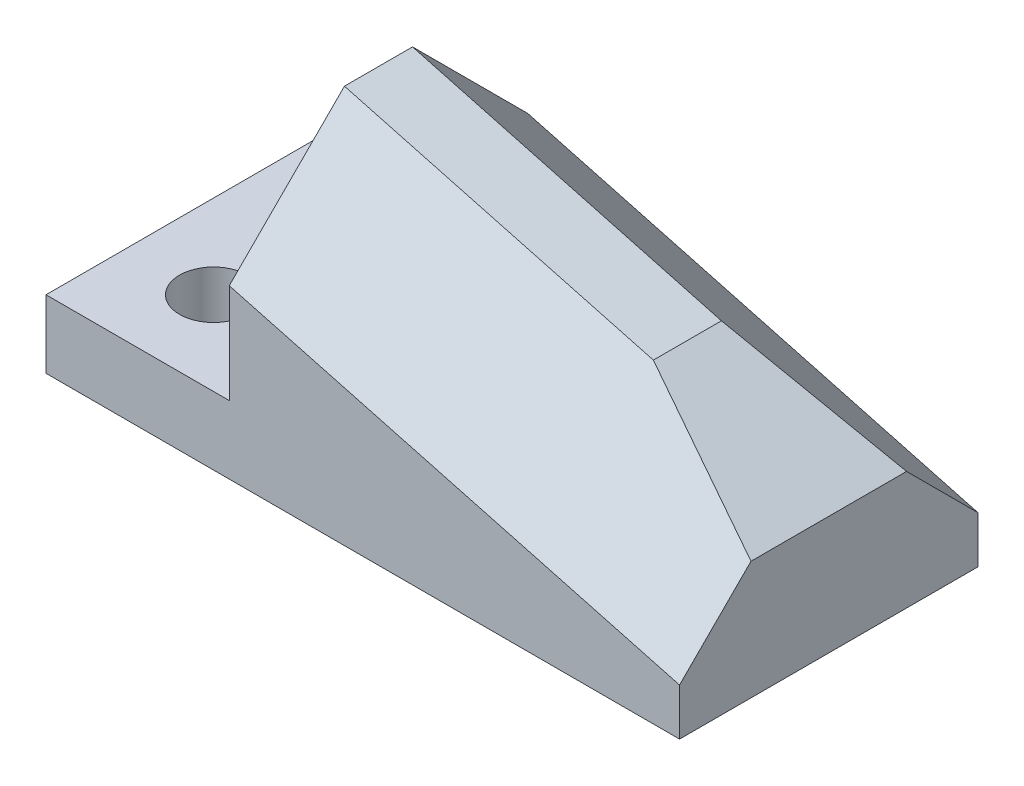
ISO-10303-21;
HEADER;
FILE_DESCRIPTION(('STEP AP214'),'2;1');
FILE_NAME('part.step','',(''),(''),'','','');
FILE_SCHEMA(('AUTOMOTIVE_DESIGN { 1 0 10303 214 1 1 1 1 }'));
ENDSEC;
DATA;
#1=APPLICATION_CONTEXT('core data for automotive mechanical design processes');
#2=APPLICATION_PROTOCOL_DEFINITION('international standard','automotive_design',2000,#1);
#3=PRODUCT_CONTEXT('',#1,'mechanical');
#4=PRODUCT('Part','Part','',(#3));
#5=PRODUCT_RELATED_PRODUCT_CATEGORY('part','',(#4));
#6=PRODUCT_DEFINITION_FORMATION('','',#4);
#7=PRODUCT_DEFINITION_CONTEXT('part definition',#1,'design');
#8=PRODUCT_DEFINITION('design','',#6,#7);
#9=PRODUCT_DEFINITION_SHAPE('','',#8);
#10=(LENGTH_UNIT() NAMED_UNIT(*) SI_UNIT(.MILLI.,.METRE.));
#11=(NAMED_UNIT(*) PLANE_ANGLE_UNIT() SI_UNIT($,.RADIAN.));
#12=(NAMED_UNIT(*) SI_UNIT($,.STERADIAN.) SOLID_ANGLE_UNIT());
#13=UNCERTAINTY_MEASURE_WITH_UNIT(LENGTH_MEASURE(1.E-05),#10,'distance_accuracy_value','');
#14=(GEOMETRIC_REPRESENTATION_CONTEXT(3) GLOBAL_UNCERTAINTY_ASSIGNED_CONTEXT((#13)) GLOBAL_UNIT_ASSIGNED_CONTEXT((#10,
#11,#12)) REPRESENTATION_CONTEXT('',''));
#15=CARTESIAN_POINT('',(0.,0.,0.));
#16=DIRECTION('',(0.,0.,1.));
#17=DIRECTION('',(1.,0.,0.));
#18=AXIS2_PLACEMENT_3D('',#15,#16,#17);
#19=CARTESIAN_POINT('',(-60.5,13.,28.5));
#20=DIRECTION('',(0.,-1.,0.));
#21=DIRECTION('',(0.,0.,-1.));
#22=AXIS2_PLACEMENT_3D('',#19,#20,#21);
#23=PLANE('',#22);
#24=CARTESIAN_POINT('',(-44.5,13.,12.5));
#25=DIRECTION('',(0.,1.,0.));
#26=DIRECTION('',(0.,0.,1.));
#27=AXIS2_PLACEMENT_3D('',#24,#25,#26);
#28=CIRCLE('',#27,6.5);
#29=CARTESIAN_POINT('',(-44.5,13.,19.));
#30=VERTEX_POINT('',#29);
#31=EDGE_CURVE('E156',#30,#30,#28,.T.);
#32=ORIENTED_EDGE('',*,*,#31,.F.);
#33=EDGE_LOOP('',(#32));
#34=FACE_BOUND('',#33,.T.);
#35=CARTESIAN_POINT('',(-44.5,13.,-12.5));
#36=DIRECTION('',(0.,1.,0.));
#37=DIRECTION('',(0.,0.,1.));
#38=AXIS2_PLACEMENT_3D('',#35,#36,#37);
#39=CIRCLE('',#38,6.5);
#40=CARTESIAN_POINT('',(-44.5,13.,-6.));
#41=VERTEX_POINT('',#40);
#42=EDGE_CURVE('E148',#41,#41,#39,.T.);
#43=ORIENTED_EDGE('',*,*,#42,.F.);
#44=EDGE_LOOP('',(#43));
#45=FACE_BOUND('',#44,.T.);
#46=DIRECTION('',(0.,0.,1.));
#47=VECTOR('',#46,1.);
#48=CARTESIAN_POINT('',(-25.5,13.,-28.5));
#49=LINE('',#48,#47);
#50=CARTESIAN_POINT('',(-25.5,13.,-28.5));
#51=VERTEX_POINT('',#50);
#52=CARTESIAN_POINT('',(-25.5,13.,28.5));
#53=VERTEX_POINT('',#52);
#54=EDGE_CURVE('E160',#51,#53,#49,.T.);
#55=ORIENTED_EDGE('',*,*,#54,.F.);
#56=DIRECTION('',(-1.,0.,0.));
#57=VECTOR('',#56,1.);
#58=CARTESIAN_POINT('',(-60.5,13.,-28.5));
#59=LINE('',#58,#57);
#60=CARTESIAN_POINT('',(-60.5,13.,-28.5));
#61=VERTEX_POINT('',#60);
#62=EDGE_CURVE('E166',#51,#61,#59,.T.);
#63=ORIENTED_EDGE('',*,*,#62,.T.);
#64=DIRECTION('',(0.,0.,-1.));
#65=VECTOR('',#64,1.);
#66=CARTESIAN_POINT('',(-60.5,13.,28.5));
#67=LINE('',#66,#65);
#68=CARTESIAN_POINT('',(-60.5,13.,28.5));
#69=VERTEX_POINT('',#68);
#70=EDGE_CURVE('E176',#69,#61,#67,.T.);
#71=ORIENTED_EDGE('',*,*,#70,.F.);
#72=DIRECTION('',(-1.,0.,0.));
#73=VECTOR('',#72,1.);
#74=CARTESIAN_POINT('',(-60.5,13.,28.5));
#75=LINE('',#74,#73);
#76=EDGE_CURVE('E173',#53,#69,#75,.T.);
#77=ORIENTED_EDGE('',*,*,#76,.F.);
#78=EDGE_LOOP('',(#55,#63,#71,#77));
#79=FACE_BOUND('',#78,.T.);
#80=ADVANCED_FACE('F39',(#34,#45,#79),#23,.F.);
#81=CARTESIAN_POINT('',(-60.5,0.,28.5));
#82=DIRECTION('',(1.,0.,0.));
#83=DIRECTION('',(0.,0.,-1.));
#84=AXIS2_PLACEMENT_3D('',#81,#82,#83);
#85=PLANE('',#84);
#86=DIRECTION('',(0.,-1.,0.));
#87=VECTOR('',#86,1.);
#88=CARTESIAN_POINT('',(-60.5,0.,-28.5));
#89=LINE('',#88,#87);
#90=CARTESIAN_POINT('',(-60.5,0.,-28.5));
#91=VERTEX_POINT('',#90);
#92=EDGE_CURVE('E147',#61,#91,#89,.T.);
#93=ORIENTED_EDGE('',*,*,#92,.T.);
#94=DIRECTION('',(0.,0.,-1.));
#95=VECTOR('',#94,1.);
#96=CARTESIAN_POINT('',(-60.5,0.,28.5));
#97=LINE('',#96,#95);
#98=CARTESIAN_POINT('',(-60.5,0.,28.5));
#99=VERTEX_POINT('',#98);
#100=EDGE_CURVE('E11',#99,#91,#97,.T.);
#101=ORIENTED_EDGE('',*,*,#100,.F.);
#102=DIRECTION('',(0.,-1.,0.));
#103=VECTOR('',#102,1.);
#104=CARTESIAN_POINT('',(-60.5,0.,28.5));
#105=LINE('',#104,#103);
#106=EDGE_CURVE('E161',#69,#99,#105,.T.);
#107=ORIENTED_EDGE('',*,*,#106,.F.);
#108=ORIENTED_EDGE('',*,*,#70,.T.);
#109=EDGE_LOOP('',(#93,#101,#107,#108));
#110=FACE_BOUND('',#109,.T.);
#111=ADVANCED_FACE('F41',(#110),#85,.F.);
#112=CARTESIAN_POINT('',(-60.5,0.,28.5));
#113=DIRECTION('',(0.,1.,0.));
#114=DIRECTION('',(0.,0.,1.));
#115=AXIS2_PLACEMENT_3D('',#112,#113,#114);
#116=PLANE('',#115);
#117=CARTESIAN_POINT('',(-44.5,0.,-12.5));
#118=DIRECTION('',(0.,1.,0.));
#119=DIRECTION('',(0.,0.,1.));
#120=AXIS2_PLACEMENT_3D('',#117,#118,#119);
#121=CIRCLE('',#120,6.5);
#122=CARTESIAN_POINT('',(-44.5,0.,-6.));
#123=VERTEX_POINT('',#122);
#124=EDGE_CURVE('E143',#123,#123,#121,.T.);
#125=ORIENTED_EDGE('',*,*,#124,.T.);
#126=EDGE_LOOP('',(#125));
#127=FACE_BOUND('',#126,.T.);
#128=CARTESIAN_POINT('',(-44.5,0.,12.5));
#129=DIRECTION('',(0.,1.,0.));
#130=DIRECTION('',(0.,0.,1.));
#131=AXIS2_PLACEMENT_3D('',#128,#129,#130);
#132=CIRCLE('',#131,6.5);
#133=CARTESIAN_POINT('',(-44.5,0.,19.));
#134=VERTEX_POINT('',#133);
#135=EDGE_CURVE('E152',#134,#134,#132,.T.);
#136=ORIENTED_EDGE('',*,*,#135,.T.);
#137=EDGE_LOOP('',(#136));
#138=FACE_BOUND('',#137,.T.);
#139=DIRECTION('',(1.,0.,0.));
#140=VECTOR('',#139,1.);
#141=CARTESIAN_POINT('',(-60.5,0.,-28.5));
#142=LINE('',#141,#140);
#143=CARTESIAN_POINT('',(60.5,0.,-28.5));
#144=VERTEX_POINT('',#143);
#145=EDGE_CURVE('E180',#91,#144,#142,.T.);
#146=ORIENTED_EDGE('',*,*,#145,.T.);
#147=DIRECTION('',(0.,0.,-1.));
#148=VECTOR('',#147,1.);
#149=CARTESIAN_POINT('',(60.5,0.,28.5));
#150=LINE('',#149,#148);
#151=CARTESIAN_POINT('',(60.5,0.,28.5));
#152=VERTEX_POINT('',#151);
#153=EDGE_CURVE('E48',#152,#144,#150,.T.);
#154=ORIENTED_EDGE('',*,*,#153,.F.);
#155=DIRECTION('',(1.,0.,0.));
#156=VECTOR('',#155,1.);
#157=CARTESIAN_POINT('',(-60.5,0.,28.5));
#158=LINE('',#157,#156);
#159=EDGE_CURVE('E165',#99,#152,#158,.T.);
#160=ORIENTED_EDGE('',*,*,#159,.F.);
#161=ORIENTED_EDGE('',*,*,#100,.T.);
#162=EDGE_LOOP('',(#146,#154,#160,#161));
#163=FACE_BOUND('',#162,.T.);
#164=ADVANCED_FACE('F246',(#127,#138,#163),#116,.F.);
#165=CARTESIAN_POINT('',(60.5,0.,28.5));
#166=DIRECTION('',(-1.,0.,0.));
#167=DIRECTION('',(0.,0.,1.));
#168=AXIS2_PLACEMENT_3D('',#165,#166,#167);
#169=PLANE('',#168);
#170=DIRECTION('',(0.,1.,0.));
#171=VECTOR('',#170,1.);
#172=CARTESIAN_POINT('',(60.5,0.,-28.5));
#173=LINE('',#172,#171);
#174=CARTESIAN_POINT('',(60.5,8.95636945092341,-28.5));
#175=VERTEX_POINT('',#174);
#176=EDGE_CURVE('E123',#144,#175,#173,.T.);
#177=ORIENTED_EDGE('',*,*,#176,.T.);
#178=DIRECTION('',(0.,-0.707106781186548,-0.707106781186547));
#179=VECTOR('',#178,1.);
#180=CARTESIAN_POINT('',(60.5,18.7281847254617,-18.7281847254617));
#181=LINE('',#180,#179);
#182=CARTESIAN_POINT('',(60.5,22.6025403784438,-14.8538290724796));
#183=VERTEX_POINT('',#182);
#184=EDGE_CURVE('E112',#183,#175,#181,.T.);
#185=ORIENTED_EDGE('',*,*,#184,.F.);
#186=DIRECTION('',(0.,0.,1.));
#187=VECTOR('',#186,1.);
#188=CARTESIAN_POINT('',(60.5,22.6025403784438,-28.5));
#189=LINE('',#188,#187);
#190=CARTESIAN_POINT('',(60.5,22.6025403784438,14.8538290724796));
#191=VERTEX_POINT('',#190);
#192=EDGE_CURVE('E63',#183,#191,#189,.T.);
#193=ORIENTED_EDGE('',*,*,#192,.T.);
#194=DIRECTION('',(0.,0.707106781186548,-0.707106781186547));
#195=VECTOR('',#194,1.);
#196=CARTESIAN_POINT('',(60.5,18.7281847254617,18.7281847254617));
#197=LINE('',#196,#195);
#198=CARTESIAN_POINT('',(60.5,8.95636945092337,28.5));
#199=VERTEX_POINT('',#198);
#200=EDGE_CURVE('E219',#199,#191,#197,.T.);
#201=ORIENTED_EDGE('',*,*,#200,.F.);
#202=DIRECTION('',(0.,1.,0.));
#203=VECTOR('',#202,1.);
#204=CARTESIAN_POINT('',(60.5,0.,28.5));
#205=LINE('',#204,#203);
#206=EDGE_CURVE('E169',#152,#199,#205,.T.);
#207=ORIENTED_EDGE('',*,*,#206,.F.);
#208=ORIENTED_EDGE('',*,*,#153,.T.);
#209=EDGE_LOOP('',(#177,#185,#193,#201,#207,#208));
#210=FACE_BOUND('',#209,.T.);
#211=ADVANCED_FACE('F120',(#210),#169,.F.);
#212=CARTESIAN_POINT('',(0.,0.,28.5));
#213=DIRECTION('',(0.,0.,-1.));
#214=DIRECTION('',(-1.,0.,0.));
#215=AXIS2_PLACEMENT_3D('',#212,#213,#214);
#216=PLANE('',#215);
#217=ORIENTED_EDGE('',*,*,#206,.T.);
#218=DIRECTION('',(0.965925826289068,-0.258819045102521,0.));
#219=VECTOR('',#218,1.);
#220=CARTESIAN_POINT('',(6.29182389825159,23.481406460551,28.5));
#221=LINE('',#220,#219);
#222=CARTESIAN_POINT('',(-25.5,32.,28.5));
#223=VERTEX_POINT('',#222);
#224=EDGE_CURVE('E216',#223,#199,#221,.T.);
#225=ORIENTED_EDGE('',*,*,#224,.F.);
#226=DIRECTION('',(0.,-1.,0.));
#227=VECTOR('',#226,1.);
#228=CARTESIAN_POINT('',(-25.5,13.,28.5));
#229=LINE('',#228,#227);
#230=EDGE_CURVE('E139',#223,#53,#229,.T.);
#231=ORIENTED_EDGE('',*,*,#230,.T.);
#232=ORIENTED_EDGE('',*,*,#76,.T.);
#233=ORIENTED_EDGE('',*,*,#106,.T.);
#234=ORIENTED_EDGE('',*,*,#159,.T.);
#235=EDGE_LOOP('',(#217,#225,#231,#232,#233,#234));
#236=FACE_BOUND('',#235,.T.);
#237=ADVANCED_FACE('F240',(#236),#216,.F.);
#238=CARTESIAN_POINT('',(0.,0.,-28.5));
#239=DIRECTION('',(0.,0.,-1.));
#240=DIRECTION('',(-1.,0.,0.));
#241=AXIS2_PLACEMENT_3D('',#238,#239,#240);
#242=PLANE('',#241);
#243=DIRECTION('',(-0.965925826289068,0.258819045102521,0.));
#244=VECTOR('',#243,1.);
#245=CARTESIAN_POINT('',(-37.2613331826984,35.1514397282174,-28.5));
#246=LINE('',#245,#244);
#247=CARTESIAN_POINT('',(-25.5,32.,-28.5));
#248=VERTEX_POINT('',#247);
#249=EDGE_CURVE('E117',#175,#248,#246,.T.);
#250=ORIENTED_EDGE('',*,*,#249,.F.);
#251=ORIENTED_EDGE('',*,*,#176,.F.);
#252=ORIENTED_EDGE('',*,*,#145,.F.);
#253=ORIENTED_EDGE('',*,*,#92,.F.);
#254=ORIENTED_EDGE('',*,*,#62,.F.);
#255=DIRECTION('',(0.,-1.,0.));
#256=VECTOR('',#255,1.);
#257=CARTESIAN_POINT('',(-25.5,13.,-28.5));
#258=LINE('',#257,#256);
#259=EDGE_CURVE('E133',#248,#51,#258,.T.);
#260=ORIENTED_EDGE('',*,*,#259,.F.);
#261=EDGE_LOOP('',(#250,#251,#252,#253,#254,#260));
#262=FACE_BOUND('',#261,.T.);
#263=ADVANCED_FACE('F194',(#262),#242,.T.);
#264=CARTESIAN_POINT('',(-44.5,0.,12.5));
#265=DIRECTION('',(0.,1.,0.));
#266=DIRECTION('',(0.,0.,1.));
#267=AXIS2_PLACEMENT_3D('',#264,#265,#266);
#268=CYLINDRICAL_SURFACE('',#267,6.5);
#269=CARTESIAN_POINT('',(-44.5,0.,19.));
#270=CARTESIAN_POINT('',(-44.5,0.135416666666666,19.));
#271=CARTESIAN_POINT('',(-44.5,0.270833333333333,19.));
#272=CARTESIAN_POINT('',(-44.5,0.541666666666667,19.));
#273=CARTESIAN_POINT('',(-44.5,0.677083333333333,19.));
#274=CARTESIAN_POINT('',(-44.5,0.947916666666667,19.));
#275=CARTESIAN_POINT('',(-44.5,1.08333333333333,19.));
#276=CARTESIAN_POINT('',(-44.5,1.35416666666667,19.));
#277=CARTESIAN_POINT('',(-44.5,1.48958333333333,19.));
#278=CARTESIAN_POINT('',(-44.5,1.76041666666667,19.));
#279=CARTESIAN_POINT('',(-44.5,1.89583333333333,19.));
#280=CARTESIAN_POINT('',(-44.5,2.16666666666667,19.));
#281=CARTESIAN_POINT('',(-44.5,2.30208333333333,19.));
#282=CARTESIAN_POINT('',(-44.5,2.57291666666667,19.));
#283=CARTESIAN_POINT('',(-44.5,2.70833333333333,19.));
#284=CARTESIAN_POINT('',(-44.5,2.97916666666667,19.));
#285=CARTESIAN_POINT('',(-44.5,3.11458333333333,19.));
#286=CARTESIAN_POINT('',(-44.5,3.38541666666667,19.));
#287=CARTESIAN_POINT('',(-44.5,3.52083333333333,19.));
#288=CARTESIAN_POINT('',(-44.5,3.79166666666667,19.));
#289=CARTESIAN_POINT('',(-44.5,3.92708333333333,19.));
#290=CARTESIAN_POINT('',(-44.5,4.19791666666667,19.));
#291=CARTESIAN_POINT('',(-44.5,4.33333333333333,19.));
#292=CARTESIAN_POINT('',(-44.5,4.60416666666667,19.));
#293=CARTESIAN_POINT('',(-44.5,4.73958333333333,19.));
#294=CARTESIAN_POINT('',(-44.5,5.01041666666667,19.));
#295=CARTESIAN_POINT('',(-44.5,5.14583333333333,19.));
#296=CARTESIAN_POINT('',(-44.5,5.41666666666667,19.));
#297=CARTESIAN_POINT('',(-44.5,5.55208333333333,19.));
#298=CARTESIAN_POINT('',(-44.5,5.82291666666667,19.));
#299=CARTESIAN_POINT('',(-44.5,5.95833333333333,19.));
#300=CARTESIAN_POINT('',(-44.5,6.22916666666667,19.));
#301=CARTESIAN_POINT('',(-44.5,6.36458333333333,19.));
#302=CARTESIAN_POINT('',(-44.5,6.63541666666667,19.));
#303=CARTESIAN_POINT('',(-44.5,6.77083333333333,19.));
#304=CARTESIAN_POINT('',(-44.5,7.04166666666667,19.));
#305=CARTESIAN_POINT('',(-44.5,7.17708333333333,19.));
#306=CARTESIAN_POINT('',(-44.5,7.44791666666667,19.));
#307=CARTESIAN_POINT('',(-44.5,7.58333333333333,19.));
#308=CARTESIAN_POINT('',(-44.5,7.85416666666667,19.));
#309=CARTESIAN_POINT('',(-44.5,7.98958333333333,19.));
#310=CARTESIAN_POINT('',(-44.5,8.26041666666667,19.));
#311=CARTESIAN_POINT('',(-44.5,8.39583333333333,19.));
#312=CARTESIAN_POINT('',(-44.5,8.66666666666667,19.));
#313=CARTESIAN_POINT('',(-44.5,8.80208333333333,19.));
#314=CARTESIAN_POINT('',(-44.5,9.07291666666667,19.));
#315=CARTESIAN_POINT('',(-44.5,9.20833333333333,19.));
#316=CARTESIAN_POINT('',(-44.5,9.47916666666667,19.));
#317=CARTESIAN_POINT('',(-44.5,9.61458333333333,19.));
#318=CARTESIAN_POINT('',(-44.5,9.88541666666667,19.));
#319=CARTESIAN_POINT('',(-44.5,10.0208333333333,19.));
#320=CARTESIAN_POINT('',(-44.5,10.2916666666667,19.));
#321=CARTESIAN_POINT('',(-44.5,10.4270833333333,19.));
#322=CARTESIAN_POINT('',(-44.5,10.6979166666667,19.));
#323=CARTESIAN_POINT('',(-44.5,10.8333333333333,19.));
#324=CARTESIAN_POINT('',(-44.5,11.1041666666667,19.));
#325=CARTESIAN_POINT('',(-44.5,11.2395833333333,19.));
#326=CARTESIAN_POINT('',(-44.5,11.5104166666667,19.));
#327=CARTESIAN_POINT('',(-44.5,11.6458333333333,19.));
#328=CARTESIAN_POINT('',(-44.5,11.9166666666667,19.));
#329=CARTESIAN_POINT('',(-44.5,12.0520833333333,19.));
#330=CARTESIAN_POINT('',(-44.5,12.3229166666667,19.));
#331=CARTESIAN_POINT('',(-44.5,12.4583333333333,19.));
#332=CARTESIAN_POINT('',(-44.5,12.7291666666667,19.));
#333=CARTESIAN_POINT('',(-44.5,12.8645833333333,19.));
#334=CARTESIAN_POINT('',(-44.5,13.,19.));
#335=B_SPLINE_CURVE_WITH_KNOTS('',3,(#269,#270,#271,#272,#273,#274,#275,#276,#277,#278,#279,
#280,#281,#282,#283,#284,#285,#286,#287,#288,#289,#290,#291,#292,#293,#294,#295,#296,#297,#298,
#299,#300,#301,#302,#303,#304,#305,#306,#307,#308,#309,#310,#311,#312,#313,#314,#315,#316,#317,
#318,#319,#320,#321,#322,#323,#324,#325,#326,#327,#328,#329,#330,#331,#332,#333,#334),
.UNSPECIFIED.,.F.,.F.,(4,2,2,2,2,2,2,2,2,2,2,2,2,2,2,2,2,2,2,2,2,2,2,2,2,2,2,2,2,2,2,2,4),(0.,
0.40625,0.8125,1.21875,1.625,2.03125,2.4375,2.84375,3.25,3.65625,4.0625,4.46875,4.875,5.28125,
5.6875,6.09375,6.5,6.90625,7.3125,7.71875,8.125,8.53125,8.9375,9.34375,9.75,10.15625,10.5625,
10.96875,11.375,11.78125,12.1875,12.59375,13.),.UNSPECIFIED.);
#336=EDGE_CURVE('BSEAM265',#134,#30,#335,.T.);
#337=ORIENTED_EDGE('',*,*,#135,.F.);
#338=ORIENTED_EDGE('',*,*,#31,.T.);
#339=ORIENTED_EDGE('',*,*,#336,.T.);
#340=ORIENTED_EDGE('',*,*,#336,.F.);
#341=EDGE_LOOP('',(#337,#339,#338,#340));
#342=FACE_BOUND('',#341,.T.);
#343=ADVANCED_FACE('F265',(#342),#268,.F.);
#344=CARTESIAN_POINT('',(-44.5,0.,-12.5));
#345=DIRECTION('',(0.,1.,0.));
#346=DIRECTION('',(0.,0.,1.));
#347=AXIS2_PLACEMENT_3D('',#344,#345,#346);
#348=CYLINDRICAL_SURFACE('',#347,6.5);
#349=CARTESIAN_POINT('',(-44.5,0.,-6.));
#350=CARTESIAN_POINT('',(-44.5,0.135416666666666,-6.));
#351=CARTESIAN_POINT('',(-44.5,0.270833333333333,-6.));
#352=CARTESIAN_POINT('',(-44.5,0.541666666666667,-6.));
#353=CARTESIAN_POINT('',(-44.5,0.677083333333333,-6.));
#354=CARTESIAN_POINT('',(-44.5,0.947916666666667,-6.));
#355=CARTESIAN_POINT('',(-44.5,1.08333333333333,-6.));
#356=CARTESIAN_POINT('',(-44.5,1.35416666666667,-6.));
#357=CARTESIAN_POINT('',(-44.5,1.48958333333333,-6.));
#358=CARTESIAN_POINT('',(-44.5,1.76041666666667,-6.));
#359=CARTESIAN_POINT('',(-44.5,1.89583333333333,-6.));
#360=CARTESIAN_POINT('',(-44.5,2.16666666666667,-6.));
#361=CARTESIAN_POINT('',(-44.5,2.30208333333333,-6.));
#362=CARTESIAN_POINT('',(-44.5,2.57291666666667,-6.));
#363=CARTESIAN_POINT('',(-44.5,2.70833333333333,-6.));
#364=CARTESIAN_POINT('',(-44.5,2.97916666666667,-6.));
#365=CARTESIAN_POINT('',(-44.5,3.11458333333333,-6.));
#366=CARTESIAN_POINT('',(-44.5,3.38541666666667,-6.));
#367=CARTESIAN_POINT('',(-44.5,3.52083333333333,-6.));
#368=CARTESIAN_POINT('',(-44.5,3.79166666666667,-6.));
#369=CARTESIAN_POINT('',(-44.5,3.92708333333333,-6.));
#370=CARTESIAN_POINT('',(-44.5,4.19791666666667,-6.));
#371=CARTESIAN_POINT('',(-44.5,4.33333333333333,-6.));
#372=CARTESIAN_POINT('',(-44.5,4.60416666666667,-6.));
#373=CARTESIAN_POINT('',(-44.5,4.73958333333333,-6.));
#374=CARTESIAN_POINT('',(-44.5,5.01041666666667,-6.));
#375=CARTESIAN_POINT('',(-44.5,5.14583333333333,-6.));
#376=CARTESIAN_POINT('',(-44.5,5.41666666666667,-6.));
#377=CARTESIAN_POINT('',(-44.5,5.55208333333333,-6.));
#378=CARTESIAN_POINT('',(-44.5,5.82291666666667,-6.));
#379=CARTESIAN_POINT('',(-44.5,5.95833333333333,-6.));
#380=CARTESIAN_POINT('',(-44.5,6.22916666666667,-6.));
#381=CARTESIAN_POINT('',(-44.5,6.36458333333333,-6.));
#382=CARTESIAN_POINT('',(-44.5,6.63541666666667,-6.));
#383=CARTESIAN_POINT('',(-44.5,6.77083333333333,-6.));
#384=CARTESIAN_POINT('',(-44.5,7.04166666666667,-6.));
#385=CARTESIAN_POINT('',(-44.5,7.17708333333333,-6.));
#386=CARTESIAN_POINT('',(-44.5,7.44791666666667,-6.));
#387=CARTESIAN_POINT('',(-44.5,7.58333333333333,-6.));
#388=CARTESIAN_POINT('',(-44.5,7.85416666666667,-6.));
#389=CARTESIAN_POINT('',(-44.5,7.98958333333333,-6.));
#390=CARTESIAN_POINT('',(-44.5,8.26041666666667,-6.));
#391=CARTESIAN_POINT('',(-44.5,8.39583333333333,-6.));
#392=CARTESIAN_POINT('',(-44.5,8.66666666666667,-6.));
#393=CARTESIAN_POINT('',(-44.5,8.80208333333333,-6.));
#394=CARTESIAN_POINT('',(-44.5,9.07291666666667,-6.));
#395=CARTESIAN_POINT('',(-44.5,9.20833333333333,-6.));
#396=CARTESIAN_POINT('',(-44.5,9.47916666666667,-6.));
#397=CARTESIAN_POINT('',(-44.5,9.61458333333333,-6.));
#398=CARTESIAN_POINT('',(-44.5,9.88541666666667,-6.));
#399=CARTESIAN_POINT('',(-44.5,10.0208333333333,-6.));
#400=CARTESIAN_POINT('',(-44.5,10.2916666666667,-6.));
#401=CARTESIAN_POINT('',(-44.5,10.4270833333333,-6.));
#402=CARTESIAN_POINT('',(-44.5,10.6979166666667,-6.));
#403=CARTESIAN_POINT('',(-44.5,10.8333333333333,-6.));
#404=CARTESIAN_POINT('',(-44.5,11.1041666666667,-6.));
#405=CARTESIAN_POINT('',(-44.5,11.2395833333333,-6.));
#406=CARTESIAN_POINT('',(-44.5,11.5104166666667,-6.));
#407=CARTESIAN_POINT('',(-44.5,11.6458333333333,-6.));
#408=CARTESIAN_POINT('',(-44.5,11.9166666666667,-6.));
#409=CARTESIAN_POINT('',(-44.5,12.0520833333333,-6.));
#410=CARTESIAN_POINT('',(-44.5,12.3229166666667,-6.));
#411=CARTESIAN_POINT('',(-44.5,12.4583333333333,-6.));
#412=CARTESIAN_POINT('',(-44.5,12.7291666666667,-6.));
#413=CARTESIAN_POINT('',(-44.5,12.8645833333333,-6.));
#414=CARTESIAN_POINT('',(-44.5,13.,-6.));
#415=B_SPLINE_CURVE_WITH_KNOTS('',3,(#349,#350,#351,#352,#353,#354,#355,#356,#357,#358,#359,
#360,#361,#362,#363,#364,#365,#366,#367,#368,#369,#370,#371,#372,#373,#374,#375,#376,#377,#378,
#379,#380,#381,#382,#383,#384,#385,#386,#387,#388,#389,#390,#391,#392,#393,#394,#395,#396,#397,
#398,#399,#400,#401,#402,#403,#404,#405,#406,#407,#408,#409,#410,#411,#412,#413,#414),
.UNSPECIFIED.,.F.,.F.,(4,2,2,2,2,2,2,2,2,2,2,2,2,2,2,2,2,2,2,2,2,2,2,2,2,2,2,2,2,2,2,2,4),(0.,
0.40625,0.8125,1.21875,1.625,2.03125,2.4375,2.84375,3.25,3.65625,4.0625,4.46875,4.875,5.28125,
5.6875,6.09375,6.5,6.90625,7.3125,7.71875,8.125,8.53125,8.9375,9.34375,9.75,10.15625,10.5625,
10.96875,11.375,11.78125,12.1875,12.59375,13.),.UNSPECIFIED.);
#416=EDGE_CURVE('BSEAM270',#123,#41,#415,.T.);
#417=ORIENTED_EDGE('',*,*,#124,.F.);
#418=ORIENTED_EDGE('',*,*,#42,.T.);
#419=ORIENTED_EDGE('',*,*,#416,.T.);
#420=ORIENTED_EDGE('',*,*,#416,.F.);
#421=EDGE_LOOP('',(#417,#419,#418,#420));
#422=FACE_BOUND('',#421,.T.);
#423=ADVANCED_FACE('F270',(#422),#348,.F.);
#424=CARTESIAN_POINT('',(-25.5,13.,-28.5));
#425=DIRECTION('',(-1.,0.,0.));
#426=DIRECTION('',(0.,-1.,0.));
#427=AXIS2_PLACEMENT_3D('',#424,#425,#426);
#428=PLANE('',#427);
#429=DIRECTION('',(0.,-0.707106781186548,-0.707106781186547));
#430=VECTOR('',#429,1.);
#431=CARTESIAN_POINT('',(-25.5,30.25,-30.25));
#432=LINE('',#431,#430);
#433=CARTESIAN_POINT('',(-25.5,54.,-6.50000000000002));
#434=VERTEX_POINT('',#433);
#435=EDGE_CURVE('E125',#434,#248,#432,.T.);
#436=ORIENTED_EDGE('',*,*,#435,.T.);
#437=ORIENTED_EDGE('',*,*,#259,.T.);
#438=ORIENTED_EDGE('',*,*,#54,.T.);
#439=ORIENTED_EDGE('',*,*,#230,.F.);
#440=DIRECTION('',(0.,0.707106781186548,-0.707106781186547));
#441=VECTOR('',#440,1.);
#442=CARTESIAN_POINT('',(-25.5,30.25,30.25));
#443=LINE('',#442,#441);
#444=CARTESIAN_POINT('',(-25.5,54.,6.49999999999997));
#445=VERTEX_POINT('',#444);
#446=EDGE_CURVE('E212',#223,#445,#443,.T.);
#447=ORIENTED_EDGE('',*,*,#446,.T.);
#448=DIRECTION('',(0.,0.,1.));
#449=VECTOR('',#448,1.);
#450=CARTESIAN_POINT('',(-25.5,54.,-28.5));
#451=LINE('',#450,#449);
#452=EDGE_CURVE('E137',#434,#445,#451,.T.);
#453=ORIENTED_EDGE('',*,*,#452,.F.);
#454=EDGE_LOOP('',(#436,#437,#438,#439,#447,#453));
#455=FACE_BOUND('',#454,.T.);
#456=ADVANCED_FACE('F236',(#455),#428,.T.);
#457=CARTESIAN_POINT('',(-25.5,54.,-28.5));
#458=DIRECTION('',(0.258819045102521,0.965925826289068,0.));
#459=DIRECTION('',(-0.965925826289068,0.258819045102521,0.));
#460=AXIS2_PLACEMENT_3D('',#457,#458,#459);
#461=PLANE('',#460);
#462=DIRECTION('',(0.965925826289068,-0.258819045102521,0.));
#463=VECTOR('',#462,1.);
#464=CARTESIAN_POINT('',(-37.2613331826984,57.1514397282174,-6.5));
#465=LINE('',#464,#463);
#466=CARTESIAN_POINT('',(33.5,38.1909976465637,-6.50000000000002));
#467=VERTEX_POINT('',#466);
#468=EDGE_CURVE('E55',#434,#467,#465,.T.);
#469=ORIENTED_EDGE('',*,*,#468,.F.);
#470=ORIENTED_EDGE('',*,*,#452,.T.);
#471=DIRECTION('',(0.965925826289068,-0.258819045102521,0.));
#472=VECTOR('',#471,1.);
#473=CARTESIAN_POINT('',(11.7918238982516,44.0076859021798,6.49999999999998));
#474=LINE('',#473,#472);
#475=CARTESIAN_POINT('',(33.5,38.1909976465637,6.49999999999997));
#476=VERTEX_POINT('',#475);
#477=EDGE_CURVE('E208',#445,#476,#474,.T.);
#478=ORIENTED_EDGE('',*,*,#477,.T.);
#479=DIRECTION('',(0.,0.,1.));
#480=VECTOR('',#479,1.);
#481=CARTESIAN_POINT('',(33.5,38.1909976465637,-28.5));
#482=LINE('',#481,#480);
#483=EDGE_CURVE('E132',#467,#476,#482,.T.);
#484=ORIENTED_EDGE('',*,*,#483,.F.);
#485=EDGE_LOOP('',(#469,#470,#478,#484));
#486=FACE_BOUND('',#485,.T.);
#487=ADVANCED_FACE('F230',(#486),#461,.T.);
#488=CARTESIAN_POINT('',(33.5,38.1909976465637,-28.5));
#489=DIRECTION('',(0.500000000000001,0.866025403784438,0.));
#490=DIRECTION('',(-0.866025403784438,0.500000000000001,0.));
#491=AXIS2_PLACEMENT_3D('',#488,#489,#490);
#492=PLANE('',#491);
#493=DIRECTION('',(-0.836516303737807,0.482962913144535,0.258819045102521));
#494=VECTOR('',#493,1.);
#495=CARTESIAN_POINT('',(24.080170181988,43.6295389277134,-3.58549451142524));
#496=LINE('',#495,#494);
#497=EDGE_CURVE('E110',#183,#467,#496,.T.);
#498=ORIENTED_EDGE('',*,*,#497,.T.);
#499=ORIENTED_EDGE('',*,*,#483,.T.);
#500=DIRECTION('',(0.836516303737807,-0.482962913144535,0.258819045102521));
#501=VECTOR('',#500,1.);
#502=CARTESIAN_POINT('',(24.080170181988,43.6295389277134,3.58549451142521));
#503=LINE('',#502,#501);
#504=EDGE_CURVE('E130',#476,#191,#503,.T.);
#505=ORIENTED_EDGE('',*,*,#504,.T.);
#506=ORIENTED_EDGE('',*,*,#192,.F.);
#507=EDGE_LOOP('',(#498,#499,#505,#506));
#508=FACE_BOUND('',#507,.T.);
#509=ADVANCED_FACE('F128',(#508),#492,.T.);
#510=CARTESIAN_POINT('',(6.94088760261012,25.9037451825659,25.9037451825659));
#511=DIRECTION('',(-0.186156787897386,-0.694746590606865,-0.694746590606866));
#512=DIRECTION('',(0.,0.707106781186548,-0.707106781186547));
#513=AXIS2_PLACEMENT_3D('',#510,#511,#512);
#514=PLANE('',#513);
#515=ORIENTED_EDGE('',*,*,#200,.T.);
#516=ORIENTED_EDGE('',*,*,#504,.F.);
#517=ORIENTED_EDGE('',*,*,#477,.F.);
#518=ORIENTED_EDGE('',*,*,#446,.F.);
#519=ORIENTED_EDGE('',*,*,#224,.T.);
#520=EDGE_LOOP('',(#515,#516,#517,#518,#519));
#521=FACE_BOUND('',#520,.T.);
#522=ADVANCED_FACE('F233',(#521),#514,.F.);
#523=CARTESIAN_POINT('',(6.94088760261012,25.9037451825659,-25.9037451825659));
#524=DIRECTION('',(-0.186156787897386,-0.694746590606866,0.694746590606866));
#525=DIRECTION('',(0.,-0.707106781186548,-0.707106781186547));
#526=AXIS2_PLACEMENT_3D('',#523,#524,#525);
#527=PLANE('',#526);
#528=ORIENTED_EDGE('',*,*,#468,.T.);
#529=ORIENTED_EDGE('',*,*,#497,.F.);
#530=ORIENTED_EDGE('',*,*,#184,.T.);
#531=ORIENTED_EDGE('',*,*,#249,.T.);
#532=ORIENTED_EDGE('',*,*,#435,.F.);
#533=EDGE_LOOP('',(#528,#529,#530,#531,#532));
#534=FACE_BOUND('',#533,.T.);
#535=ADVANCED_FACE('F111',(#534),#527,.F.);
#536=CLOSED_SHELL('',(#80,#111,#164,#211,#237,#263,#343,#423,#456,#487,#509,#522,#535));
#537=MANIFOLD_SOLID_BREP('B2',#536);
#538=ADVANCED_BREP_SHAPE_REPRESENTATION('',(#18,#537),#14);
#539=SHAPE_DEFINITION_REPRESENTATION(#9,#538);
ENDSEC;
END-ISO-10303-21;
